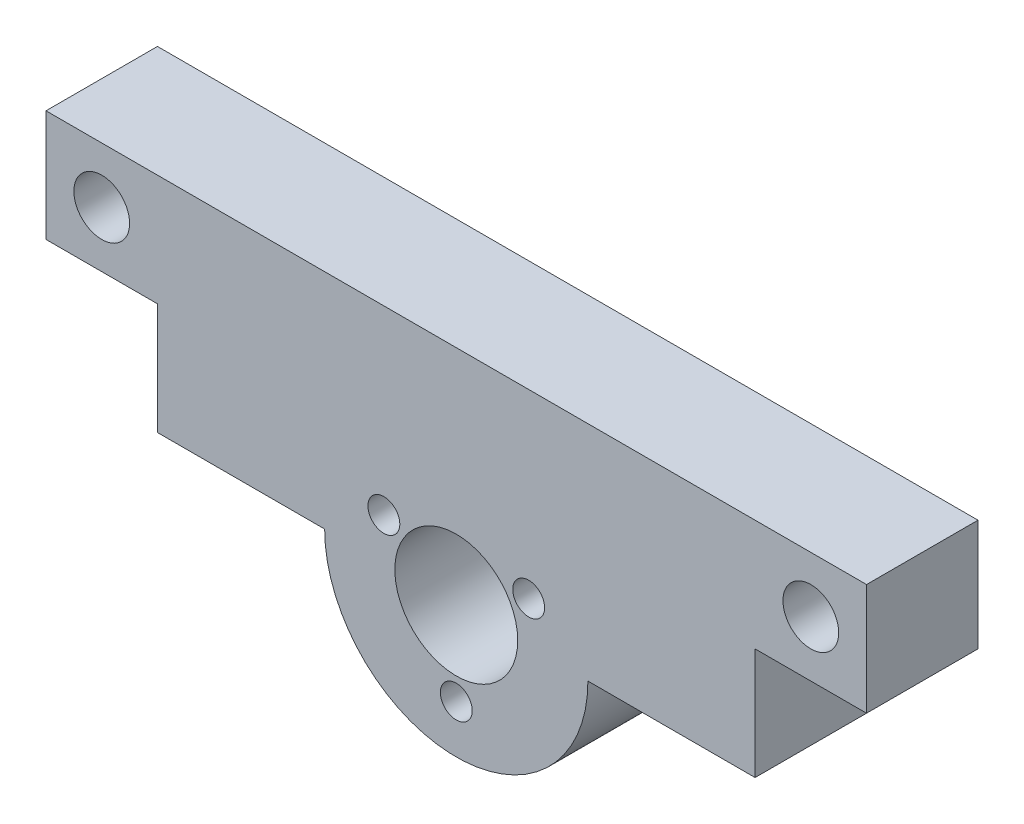
ISO-10303-21;
HEADER;
FILE_DESCRIPTION(('STEP AP214'),'2;1');
FILE_NAME('part.step','',(''),(''),'','','');
FILE_SCHEMA(('AUTOMOTIVE_DESIGN { 1 0 10303 214 1 1 1 1 }'));
ENDSEC;
DATA;
#1=APPLICATION_CONTEXT('core data for automotive mechanical design processes');
#2=APPLICATION_PROTOCOL_DEFINITION('international standard','automotive_design',2000,#1);
#3=PRODUCT_CONTEXT('',#1,'mechanical');
#4=PRODUCT('Part','Part','',(#3));
#5=PRODUCT_RELATED_PRODUCT_CATEGORY('part','',(#4));
#6=PRODUCT_DEFINITION_FORMATION('','',#4);
#7=PRODUCT_DEFINITION_CONTEXT('part definition',#1,'design');
#8=PRODUCT_DEFINITION('design','',#6,#7);
#9=PRODUCT_DEFINITION_SHAPE('','',#8);
#10=(LENGTH_UNIT() NAMED_UNIT(*) SI_UNIT(.MILLI.,.METRE.));
#11=(NAMED_UNIT(*) PLANE_ANGLE_UNIT() SI_UNIT($,.RADIAN.));
#12=(NAMED_UNIT(*) SI_UNIT($,.STERADIAN.) SOLID_ANGLE_UNIT());
#13=UNCERTAINTY_MEASURE_WITH_UNIT(LENGTH_MEASURE(1.E-05),#10,'distance_accuracy_value','');
#14=(GEOMETRIC_REPRESENTATION_CONTEXT(3) GLOBAL_UNCERTAINTY_ASSIGNED_CONTEXT((#13)) GLOBAL_UNIT_ASSIGNED_CONTEXT((#10,
#11,#12)) REPRESENTATION_CONTEXT('',''));
#15=CARTESIAN_POINT('',(0.,0.,0.));
#16=DIRECTION('',(0.,0.,1.));
#17=DIRECTION('',(1.,0.,0.));
#18=AXIS2_PLACEMENT_3D('',#15,#16,#17);
#19=CARTESIAN_POINT('',(0.,9.525,12.7));
#20=DIRECTION('',(0.,-1.,0.));
#21=DIRECTION('',(0.,0.,-1.));
#22=AXIS2_PLACEMENT_3D('',#19,#20,#21);
#23=PLANE('',#22);
#24=DIRECTION('',(-1.,0.,0.));
#25=VECTOR('',#24,1.);
#26=CARTESIAN_POINT('',(0.,9.525,0.));
#27=LINE('',#26,#25);
#28=CARTESIAN_POINT('',(-15.,9.525,0.));
#29=VERTEX_POINT('',#28);
#30=CARTESIAN_POINT('',(-34.05,9.525,0.));
#31=VERTEX_POINT('',#30);
#32=EDGE_CURVE('E161',#29,#31,#27,.T.);
#33=ORIENTED_EDGE('',*,*,#32,.F.);
#34=DIRECTION('',(0.,0.,-1.));
#35=VECTOR('',#34,1.);
#36=CARTESIAN_POINT('',(-15.,9.525,12.7));
#37=LINE('',#36,#35);
#38=CARTESIAN_POINT('',(-15.,9.525,12.7));
#39=VERTEX_POINT('',#38);
#40=EDGE_CURVE('E11',#39,#29,#37,.T.);
#41=ORIENTED_EDGE('',*,*,#40,.F.);
#42=DIRECTION('',(-1.,0.,0.));
#43=VECTOR('',#42,1.);
#44=CARTESIAN_POINT('',(0.,9.525,12.7));
#45=LINE('',#44,#43);
#46=CARTESIAN_POINT('',(-34.05,9.525,12.7));
#47=VERTEX_POINT('',#46);
#48=EDGE_CURVE('E236',#39,#47,#45,.T.);
#49=ORIENTED_EDGE('',*,*,#48,.T.);
#50=DIRECTION('',(0.,0.,-1.));
#51=VECTOR('',#50,1.);
#52=CARTESIAN_POINT('',(-34.05,9.525,12.7));
#53=LINE('',#52,#51);
#54=EDGE_CURVE('E52',#47,#31,#53,.T.);
#55=ORIENTED_EDGE('',*,*,#54,.T.);
#56=EDGE_LOOP('',(#33,#41,#49,#55));
#57=FACE_BOUND('',#56,.T.);
#58=ADVANCED_FACE('F35',(#57),#23,.T.);
#59=CARTESIAN_POINT('',(0.,9.525,12.7));
#60=DIRECTION('',(0.,0.,-1.));
#61=DIRECTION('',(-1.,0.,0.));
#62=AXIS2_PLACEMENT_3D('',#59,#60,#61);
#63=CYLINDRICAL_SURFACE('',#62,15.);
#64=CARTESIAN_POINT('',(0.,9.525,0.));
#65=DIRECTION('',(0.,0.,1.));
#66=DIRECTION('',(1.,0.,0.));
#67=AXIS2_PLACEMENT_3D('',#64,#65,#66);
#68=CIRCLE('',#67,15.);
#69=CARTESIAN_POINT('',(15.,9.525,0.));
#70=VERTEX_POINT('',#69);
#71=EDGE_CURVE('E163',#29,#70,#68,.T.);
#72=ORIENTED_EDGE('',*,*,#71,.T.);
#73=DIRECTION('',(0.,0.,-1.));
#74=VECTOR('',#73,1.);
#75=CARTESIAN_POINT('',(15.,9.525,12.7));
#76=LINE('',#75,#74);
#77=CARTESIAN_POINT('',(15.,9.525,12.7));
#78=VERTEX_POINT('',#77);
#79=EDGE_CURVE('E44',#78,#70,#76,.T.);
#80=ORIENTED_EDGE('',*,*,#79,.F.);
#81=CARTESIAN_POINT('',(0.,9.525,12.7));
#82=DIRECTION('',(0.,0.,1.));
#83=DIRECTION('',(1.,0.,0.));
#84=AXIS2_PLACEMENT_3D('',#81,#82,#83);
#85=CIRCLE('',#84,15.);
#86=EDGE_CURVE('E232',#39,#78,#85,.T.);
#87=ORIENTED_EDGE('',*,*,#86,.F.);
#88=ORIENTED_EDGE('',*,*,#40,.T.);
#89=EDGE_LOOP('',(#72,#80,#87,#88));
#90=FACE_BOUND('',#89,.T.);
#91=ADVANCED_FACE('F219',(#90),#63,.T.);
#92=CARTESIAN_POINT('',(0.,9.525,12.7));
#93=DIRECTION('',(0.,-1.,0.));
#94=DIRECTION('',(0.,0.,-1.));
#95=AXIS2_PLACEMENT_3D('',#92,#93,#94);
#96=PLANE('',#95);
#97=DIRECTION('',(-1.,0.,0.));
#98=VECTOR('',#97,1.);
#99=CARTESIAN_POINT('',(0.,9.525,0.));
#100=LINE('',#99,#98);
#101=CARTESIAN_POINT('',(34.05,9.525,0.));
#102=VERTEX_POINT('',#101);
#103=EDGE_CURVE('E166',#102,#70,#100,.T.);
#104=ORIENTED_EDGE('',*,*,#103,.F.);
#105=DIRECTION('',(0.,0.,-1.));
#106=VECTOR('',#105,1.);
#107=CARTESIAN_POINT('',(34.05,9.525,12.7));
#108=LINE('',#107,#106);
#109=CARTESIAN_POINT('',(34.05,9.525,12.7));
#110=VERTEX_POINT('',#109);
#111=EDGE_CURVE('E209',#110,#102,#108,.T.);
#112=ORIENTED_EDGE('',*,*,#111,.F.);
#113=DIRECTION('',(-1.,0.,0.));
#114=VECTOR('',#113,1.);
#115=CARTESIAN_POINT('',(0.,9.525,12.7));
#116=LINE('',#115,#114);
#117=EDGE_CURVE('E216',#110,#78,#116,.T.);
#118=ORIENTED_EDGE('',*,*,#117,.T.);
#119=ORIENTED_EDGE('',*,*,#79,.T.);
#120=EDGE_LOOP('',(#104,#112,#118,#119));
#121=FACE_BOUND('',#120,.T.);
#122=ADVANCED_FACE('F214',(#121),#96,.T.);
#123=CARTESIAN_POINT('',(34.05,0.,12.7));
#124=DIRECTION('',(1.,0.,0.));
#125=DIRECTION('',(0.,1.,0.));
#126=AXIS2_PLACEMENT_3D('',#123,#124,#125);
#127=PLANE('',#126);
#128=DIRECTION('',(0.,-1.,0.));
#129=VECTOR('',#128,1.);
#130=CARTESIAN_POINT('',(34.05,0.,0.));
#131=LINE('',#130,#129);
#132=CARTESIAN_POINT('',(34.05,22.225,0.));
#133=VERTEX_POINT('',#132);
#134=EDGE_CURVE('E169',#133,#102,#131,.T.);
#135=ORIENTED_EDGE('',*,*,#134,.F.);
#136=DIRECTION('',(0.,0.,-1.));
#137=VECTOR('',#136,1.);
#138=CARTESIAN_POINT('',(34.05,22.225,12.7));
#139=LINE('',#138,#137);
#140=CARTESIAN_POINT('',(34.05,22.225,12.7));
#141=VERTEX_POINT('',#140);
#142=EDGE_CURVE('E207',#141,#133,#139,.T.);
#143=ORIENTED_EDGE('',*,*,#142,.F.);
#144=DIRECTION('',(0.,-1.,0.));
#145=VECTOR('',#144,1.);
#146=CARTESIAN_POINT('',(34.05,0.,12.7));
#147=LINE('',#146,#145);
#148=EDGE_CURVE('E229',#141,#110,#147,.T.);
#149=ORIENTED_EDGE('',*,*,#148,.T.);
#150=ORIENTED_EDGE('',*,*,#111,.T.);
#151=EDGE_LOOP('',(#135,#143,#149,#150));
#152=FACE_BOUND('',#151,.T.);
#153=ADVANCED_FACE('F226',(#152),#127,.T.);
#154=CARTESIAN_POINT('',(0.,22.225,12.7));
#155=DIRECTION('',(0.,-1.,0.));
#156=DIRECTION('',(0.,0.,-1.));
#157=AXIS2_PLACEMENT_3D('',#154,#155,#156);
#158=PLANE('',#157);
#159=DIRECTION('',(-1.,0.,0.));
#160=VECTOR('',#159,1.);
#161=CARTESIAN_POINT('',(0.,22.225,0.));
#162=LINE('',#161,#160);
#163=CARTESIAN_POINT('',(46.75,22.225,0.));
#164=VERTEX_POINT('',#163);
#165=EDGE_CURVE('E172',#164,#133,#162,.T.);
#166=ORIENTED_EDGE('',*,*,#165,.F.);
#167=DIRECTION('',(0.,0.,-1.));
#168=VECTOR('',#167,1.);
#169=CARTESIAN_POINT('',(46.75,22.225,12.7));
#170=LINE('',#169,#168);
#171=CARTESIAN_POINT('',(46.75,22.225,12.7));
#172=VERTEX_POINT('',#171);
#173=EDGE_CURVE('E205',#172,#164,#170,.T.);
#174=ORIENTED_EDGE('',*,*,#173,.F.);
#175=DIRECTION('',(-1.,0.,0.));
#176=VECTOR('',#175,1.);
#177=CARTESIAN_POINT('',(0.,22.225,12.7));
#178=LINE('',#177,#176);
#179=EDGE_CURVE('E234',#172,#141,#178,.T.);
#180=ORIENTED_EDGE('',*,*,#179,.T.);
#181=ORIENTED_EDGE('',*,*,#142,.T.);
#182=EDGE_LOOP('',(#166,#174,#180,#181));
#183=FACE_BOUND('',#182,.T.);
#184=ADVANCED_FACE('F272',(#183),#158,.T.);
#185=CARTESIAN_POINT('',(46.75,0.,12.7));
#186=DIRECTION('',(1.,0.,0.));
#187=DIRECTION('',(0.,0.,-1.));
#188=AXIS2_PLACEMENT_3D('',#185,#186,#187);
#189=PLANE('',#188);
#190=DIRECTION('',(0.,-1.,0.));
#191=VECTOR('',#190,1.);
#192=CARTESIAN_POINT('',(46.75,0.,0.));
#193=LINE('',#192,#191);
#194=CARTESIAN_POINT('',(46.75,34.925,0.));
#195=VERTEX_POINT('',#194);
#196=EDGE_CURVE('E175',#195,#164,#193,.T.);
#197=ORIENTED_EDGE('',*,*,#196,.F.);
#198=DIRECTION('',(0.,0.,-1.));
#199=VECTOR('',#198,1.);
#200=CARTESIAN_POINT('',(46.75,34.925,12.7));
#201=LINE('',#200,#199);
#202=CARTESIAN_POINT('',(46.75,34.925,12.7));
#203=VERTEX_POINT('',#202);
#204=EDGE_CURVE('E203',#203,#195,#201,.T.);
#205=ORIENTED_EDGE('',*,*,#204,.F.);
#206=DIRECTION('',(0.,-1.,0.));
#207=VECTOR('',#206,1.);
#208=CARTESIAN_POINT('',(46.75,0.,12.7));
#209=LINE('',#208,#207);
#210=EDGE_CURVE('E241',#203,#172,#209,.T.);
#211=ORIENTED_EDGE('',*,*,#210,.T.);
#212=ORIENTED_EDGE('',*,*,#173,.T.);
#213=EDGE_LOOP('',(#197,#205,#211,#212));
#214=FACE_BOUND('',#213,.T.);
#215=ADVANCED_FACE('F275',(#214),#189,.T.);
#216=CARTESIAN_POINT('',(0.,34.925,12.7));
#217=DIRECTION('',(0.,1.,0.));
#218=DIRECTION('',(0.,0.,1.));
#219=AXIS2_PLACEMENT_3D('',#216,#217,#218);
#220=PLANE('',#219);
#221=DIRECTION('',(1.,0.,0.));
#222=VECTOR('',#221,1.);
#223=CARTESIAN_POINT('',(0.,34.925,0.));
#224=LINE('',#223,#222);
#225=CARTESIAN_POINT('',(-46.75,34.925,0.));
#226=VERTEX_POINT('',#225);
#227=EDGE_CURVE('E178',#226,#195,#224,.T.);
#228=ORIENTED_EDGE('',*,*,#227,.F.);
#229=DIRECTION('',(0.,0.,-1.));
#230=VECTOR('',#229,1.);
#231=CARTESIAN_POINT('',(-46.75,34.925,12.7));
#232=LINE('',#231,#230);
#233=CARTESIAN_POINT('',(-46.75,34.925,12.7));
#234=VERTEX_POINT('',#233);
#235=EDGE_CURVE('E123',#234,#226,#232,.T.);
#236=ORIENTED_EDGE('',*,*,#235,.F.);
#237=DIRECTION('',(1.,0.,0.));
#238=VECTOR('',#237,1.);
#239=CARTESIAN_POINT('',(0.,34.925,12.7));
#240=LINE('',#239,#238);
#241=EDGE_CURVE('E135',#234,#203,#240,.T.);
#242=ORIENTED_EDGE('',*,*,#241,.T.);
#243=ORIENTED_EDGE('',*,*,#204,.T.);
#244=EDGE_LOOP('',(#228,#236,#242,#243));
#245=FACE_BOUND('',#244,.T.);
#246=ADVANCED_FACE('F245',(#245),#220,.T.);
#247=CARTESIAN_POINT('',(-46.75,0.,12.7));
#248=DIRECTION('',(-1.,0.,0.));
#249=DIRECTION('',(0.,0.,1.));
#250=AXIS2_PLACEMENT_3D('',#247,#248,#249);
#251=PLANE('',#250);
#252=DIRECTION('',(0.,1.,0.));
#253=VECTOR('',#252,1.);
#254=CARTESIAN_POINT('',(-46.75,0.,0.));
#255=LINE('',#254,#253);
#256=CARTESIAN_POINT('',(-46.75,22.225,0.));
#257=VERTEX_POINT('',#256);
#258=EDGE_CURVE('E119',#257,#226,#255,.T.);
#259=ORIENTED_EDGE('',*,*,#258,.F.);
#260=DIRECTION('',(0.,0.,-1.));
#261=VECTOR('',#260,1.);
#262=CARTESIAN_POINT('',(-46.75,22.225,12.7));
#263=LINE('',#262,#261);
#264=CARTESIAN_POINT('',(-46.75,22.225,12.7));
#265=VERTEX_POINT('',#264);
#266=EDGE_CURVE('E114',#265,#257,#263,.T.);
#267=ORIENTED_EDGE('',*,*,#266,.F.);
#268=DIRECTION('',(0.,1.,0.));
#269=VECTOR('',#268,1.);
#270=CARTESIAN_POINT('',(-46.75,0.,12.7));
#271=LINE('',#270,#269);
#272=EDGE_CURVE('E117',#265,#234,#271,.T.);
#273=ORIENTED_EDGE('',*,*,#272,.T.);
#274=ORIENTED_EDGE('',*,*,#235,.T.);
#275=EDGE_LOOP('',(#259,#267,#273,#274));
#276=FACE_BOUND('',#275,.T.);
#277=ADVANCED_FACE('F116',(#276),#251,.T.);
#278=CARTESIAN_POINT('',(0.,22.225,12.7));
#279=DIRECTION('',(0.,-1.,0.));
#280=DIRECTION('',(0.,0.,-1.));
#281=AXIS2_PLACEMENT_3D('',#278,#279,#280);
#282=PLANE('',#281);
#283=DIRECTION('',(-1.,0.,0.));
#284=VECTOR('',#283,1.);
#285=CARTESIAN_POINT('',(0.,22.225,0.));
#286=LINE('',#285,#284);
#287=CARTESIAN_POINT('',(-34.05,22.225,0.));
#288=VERTEX_POINT('',#287);
#289=EDGE_CURVE('E182',#288,#257,#286,.T.);
#290=ORIENTED_EDGE('',*,*,#289,.F.);
#291=DIRECTION('',(0.,0.,-1.));
#292=VECTOR('',#291,1.);
#293=CARTESIAN_POINT('',(-34.05,22.225,12.7));
#294=LINE('',#293,#292);
#295=CARTESIAN_POINT('',(-34.05,22.225,12.7));
#296=VERTEX_POINT('',#295);
#297=EDGE_CURVE('E83',#296,#288,#294,.T.);
#298=ORIENTED_EDGE('',*,*,#297,.F.);
#299=DIRECTION('',(-1.,0.,0.));
#300=VECTOR('',#299,1.);
#301=CARTESIAN_POINT('',(0.,22.225,12.7));
#302=LINE('',#301,#300);
#303=EDGE_CURVE('E132',#296,#265,#302,.T.);
#304=ORIENTED_EDGE('',*,*,#303,.T.);
#305=ORIENTED_EDGE('',*,*,#266,.T.);
#306=EDGE_LOOP('',(#290,#298,#304,#305));
#307=FACE_BOUND('',#306,.T.);
#308=ADVANCED_FACE('F137',(#307),#282,.T.);
#309=CARTESIAN_POINT('',(0.,0.,12.7));
#310=DIRECTION('',(0.,0.,-1.));
#311=DIRECTION('',(-1.,0.,0.));
#312=AXIS2_PLACEMENT_3D('',#309,#310,#311);
#313=CYLINDRICAL_SURFACE('',#312,1.8161);
#314=CARTESIAN_POINT('',(0.,0.,12.7));
#315=DIRECTION('',(0.,0.,1.));
#316=DIRECTION('',(1.,0.,0.));
#317=AXIS2_PLACEMENT_3D('',#314,#315,#316);
#318=CIRCLE('',#317,1.8161);
#319=CARTESIAN_POINT('',(1.8161,0.,12.7));
#320=VERTEX_POINT('',#319);
#321=EDGE_CURVE('E149',#320,#320,#318,.T.);
#322=ORIENTED_EDGE('',*,*,#321,.T.);
#323=EDGE_LOOP('',(#322));
#324=FACE_BOUND('',#323,.T.);
#325=CARTESIAN_POINT('',(0.,0.,0.));
#326=DIRECTION('',(0.,0.,1.));
#327=DIRECTION('',(1.,0.,0.));
#328=AXIS2_PLACEMENT_3D('',#325,#326,#327);
#329=CIRCLE('',#328,1.8161);
#330=CARTESIAN_POINT('',(1.8161,0.,0.));
#331=VERTEX_POINT('',#330);
#332=EDGE_CURVE('E193',#331,#331,#329,.T.);
#333=ORIENTED_EDGE('',*,*,#332,.F.);
#334=EDGE_LOOP('',(#333));
#335=FACE_BOUND('',#334,.T.);
#336=ADVANCED_FACE('F284',(#324,#335),#313,.F.);
#337=CARTESIAN_POINT('',(8.24889197104678,14.2875,12.7));
#338=DIRECTION('',(0.,0.,-1.));
#339=DIRECTION('',(-1.,0.,0.));
#340=AXIS2_PLACEMENT_3D('',#337,#338,#339);
#341=CYLINDRICAL_SURFACE('',#340,1.8161);
#342=CARTESIAN_POINT('',(8.24889197104678,14.2875,12.7));
#343=DIRECTION('',(0.,0.,1.));
#344=DIRECTION('',(1.,0.,0.));
#345=AXIS2_PLACEMENT_3D('',#342,#343,#344);
#346=CIRCLE('',#345,1.8161);
#347=CARTESIAN_POINT('',(10.0649919710468,14.2875,12.7));
#348=VERTEX_POINT('',#347);
#349=EDGE_CURVE('E146',#348,#348,#346,.T.);
#350=ORIENTED_EDGE('',*,*,#349,.T.);
#351=EDGE_LOOP('',(#350));
#352=FACE_BOUND('',#351,.T.);
#353=CARTESIAN_POINT('',(8.24889197104678,14.2875,0.));
#354=DIRECTION('',(0.,0.,1.));
#355=DIRECTION('',(1.,0.,0.));
#356=AXIS2_PLACEMENT_3D('',#353,#354,#355);
#357=CIRCLE('',#356,1.8161);
#358=CARTESIAN_POINT('',(10.0649919710468,14.2875,0.));
#359=VERTEX_POINT('',#358);
#360=EDGE_CURVE('E190',#359,#359,#357,.T.);
#361=ORIENTED_EDGE('',*,*,#360,.F.);
#362=EDGE_LOOP('',(#361));
#363=FACE_BOUND('',#362,.T.);
#364=ADVANCED_FACE('F257',(#352,#363),#341,.F.);
#365=CARTESIAN_POINT('',(0.,9.525,12.7));
#366=DIRECTION('',(0.,0.,-1.));
#367=DIRECTION('',(-1.,0.,0.));
#368=AXIS2_PLACEMENT_3D('',#365,#366,#367);
#369=CYLINDRICAL_SURFACE('',#368,7.);
#370=CARTESIAN_POINT('',(0.,9.525,12.7));
#371=DIRECTION('',(0.,0.,1.));
#372=DIRECTION('',(1.,0.,0.));
#373=AXIS2_PLACEMENT_3D('',#370,#371,#372);
#374=CIRCLE('',#373,7.);
#375=CARTESIAN_POINT('',(7.,9.525,12.7));
#376=VERTEX_POINT('',#375);
#377=EDGE_CURVE('E140',#376,#376,#374,.T.);
#378=ORIENTED_EDGE('',*,*,#377,.T.);
#379=EDGE_LOOP('',(#378));
#380=FACE_BOUND('',#379,.T.);
#381=CARTESIAN_POINT('',(0.,9.525,0.));
#382=DIRECTION('',(0.,0.,1.));
#383=DIRECTION('',(1.,0.,0.));
#384=AXIS2_PLACEMENT_3D('',#381,#382,#383);
#385=CIRCLE('',#384,7.);
#386=CARTESIAN_POINT('',(7.,9.525,0.));
#387=VERTEX_POINT('',#386);
#388=EDGE_CURVE('E187',#387,#387,#385,.T.);
#389=ORIENTED_EDGE('',*,*,#388,.F.);
#390=EDGE_LOOP('',(#389));
#391=FACE_BOUND('',#390,.T.);
#392=ADVANCED_FACE('F250',(#380,#391),#369,.F.);
#393=CARTESIAN_POINT('',(-34.05,0.,12.7));
#394=DIRECTION('',(-1.,0.,0.));
#395=DIRECTION('',(0.,-1.,0.));
#396=AXIS2_PLACEMENT_3D('',#393,#394,#395);
#397=PLANE('',#396);
#398=DIRECTION('',(0.,1.,0.));
#399=VECTOR('',#398,1.);
#400=CARTESIAN_POINT('',(-34.05,0.,0.));
#401=LINE('',#400,#399);
#402=EDGE_CURVE('E184',#31,#288,#401,.T.);
#403=ORIENTED_EDGE('',*,*,#402,.F.);
#404=ORIENTED_EDGE('',*,*,#54,.F.);
#405=DIRECTION('',(0.,1.,0.));
#406=VECTOR('',#405,1.);
#407=CARTESIAN_POINT('',(-34.05,0.,12.7));
#408=LINE('',#407,#406);
#409=EDGE_CURVE('E138',#47,#296,#408,.T.);
#410=ORIENTED_EDGE('',*,*,#409,.T.);
#411=ORIENTED_EDGE('',*,*,#297,.T.);
#412=EDGE_LOOP('',(#403,#404,#410,#411));
#413=FACE_BOUND('',#412,.T.);
#414=ADVANCED_FACE('F247',(#413),#397,.T.);
#415=CARTESIAN_POINT('',(-40.4,28.575,12.7));
#416=DIRECTION('',(0.,0.,-1.));
#417=DIRECTION('',(-1.,0.,0.));
#418=AXIS2_PLACEMENT_3D('',#415,#416,#417);
#419=CYLINDRICAL_SURFACE('',#418,3.175);
#420=CARTESIAN_POINT('',(-40.4,28.575,12.7));
#421=DIRECTION('',(0.,0.,1.));
#422=DIRECTION('',(1.,0.,0.));
#423=AXIS2_PLACEMENT_3D('',#420,#421,#422);
#424=CIRCLE('',#423,3.175);
#425=CARTESIAN_POINT('',(-37.225,28.575,12.7));
#426=VERTEX_POINT('',#425);
#427=EDGE_CURVE('E313',#426,#426,#424,.T.);
#428=ORIENTED_EDGE('',*,*,#427,.T.);
#429=EDGE_LOOP('',(#428));
#430=FACE_BOUND('',#429,.T.);
#431=CARTESIAN_POINT('',(-40.4,28.575,0.));
#432=DIRECTION('',(0.,0.,1.));
#433=DIRECTION('',(1.,0.,0.));
#434=AXIS2_PLACEMENT_3D('',#431,#432,#433);
#435=CIRCLE('',#434,3.175);
#436=CARTESIAN_POINT('',(-37.225,28.575,0.));
#437=VERTEX_POINT('',#436);
#438=EDGE_CURVE('E158',#437,#437,#435,.T.);
#439=ORIENTED_EDGE('',*,*,#438,.F.);
#440=EDGE_LOOP('',(#439));
#441=FACE_BOUND('',#440,.T.);
#442=ADVANCED_FACE('F249',(#430,#441),#419,.F.);
#443=CARTESIAN_POINT('',(40.4,28.575,12.7));
#444=DIRECTION('',(0.,0.,-1.));
#445=DIRECTION('',(-1.,0.,0.));
#446=AXIS2_PLACEMENT_3D('',#443,#444,#445);
#447=CYLINDRICAL_SURFACE('',#446,3.175);
#448=CARTESIAN_POINT('',(40.4,28.575,12.7));
#449=DIRECTION('',(0.,0.,1.));
#450=DIRECTION('',(1.,0.,0.));
#451=AXIS2_PLACEMENT_3D('',#448,#449,#450);
#452=CIRCLE('',#451,3.175);
#453=CARTESIAN_POINT('',(43.575,28.575,12.7));
#454=VERTEX_POINT('',#453);
#455=EDGE_CURVE('E199',#454,#454,#452,.T.);
#456=ORIENTED_EDGE('',*,*,#455,.T.);
#457=EDGE_LOOP('',(#456));
#458=FACE_BOUND('',#457,.T.);
#459=CARTESIAN_POINT('',(40.4,28.575,0.));
#460=DIRECTION('',(0.,0.,1.));
#461=DIRECTION('',(1.,0.,0.));
#462=AXIS2_PLACEMENT_3D('',#459,#460,#461);
#463=CIRCLE('',#462,3.175);
#464=CARTESIAN_POINT('',(43.575,28.575,0.));
#465=VERTEX_POINT('',#464);
#466=EDGE_CURVE('E155',#465,#465,#463,.T.);
#467=ORIENTED_EDGE('',*,*,#466,.F.);
#468=EDGE_LOOP('',(#467));
#469=FACE_BOUND('',#468,.T.);
#470=ADVANCED_FACE('F37',(#458,#469),#447,.F.);
#471=CARTESIAN_POINT('',(-8.24889197104678,14.2875,12.7));
#472=DIRECTION('',(0.,0.,-1.));
#473=DIRECTION('',(-1.,0.,0.));
#474=AXIS2_PLACEMENT_3D('',#471,#472,#473);
#475=CYLINDRICAL_SURFACE('',#474,1.8161);
#476=CARTESIAN_POINT('',(-8.24889197104678,14.2875,12.7));
#477=DIRECTION('',(0.,0.,1.));
#478=DIRECTION('',(1.,0.,0.));
#479=AXIS2_PLACEMENT_3D('',#476,#477,#478);
#480=CIRCLE('',#479,1.8161);
#481=CARTESIAN_POINT('',(-6.43279197104678,14.2875,12.7));
#482=VERTEX_POINT('',#481);
#483=EDGE_CURVE('E152',#482,#482,#480,.T.);
#484=ORIENTED_EDGE('',*,*,#483,.T.);
#485=EDGE_LOOP('',(#484));
#486=FACE_BOUND('',#485,.T.);
#487=CARTESIAN_POINT('',(-8.24889197104678,14.2875,0.));
#488=DIRECTION('',(0.,0.,1.));
#489=DIRECTION('',(1.,0.,0.));
#490=AXIS2_PLACEMENT_3D('',#487,#488,#489);
#491=CIRCLE('',#490,1.8161);
#492=CARTESIAN_POINT('',(-6.43279197104678,14.2875,0.));
#493=VERTEX_POINT('',#492);
#494=EDGE_CURVE('E196',#493,#493,#491,.T.);
#495=ORIENTED_EDGE('',*,*,#494,.F.);
#496=EDGE_LOOP('',(#495));
#497=FACE_BOUND('',#496,.T.);
#498=ADVANCED_FACE('F297',(#486,#497),#475,.F.);
#499=CARTESIAN_POINT('',(0.,0.,12.7));
#500=DIRECTION('',(0.,0.,1.));
#501=DIRECTION('',(1.,0.,0.));
#502=AXIS2_PLACEMENT_3D('',#499,#500,#501);
#503=PLANE('',#502);
#504=ORIENTED_EDGE('',*,*,#455,.F.);
#505=EDGE_LOOP('',(#504));
#506=FACE_BOUND('',#505,.T.);
#507=ORIENTED_EDGE('',*,*,#427,.F.);
#508=EDGE_LOOP('',(#507));
#509=FACE_BOUND('',#508,.T.);
#510=ORIENTED_EDGE('',*,*,#48,.F.);
#511=ORIENTED_EDGE('',*,*,#86,.T.);
#512=ORIENTED_EDGE('',*,*,#117,.F.);
#513=ORIENTED_EDGE('',*,*,#148,.F.);
#514=ORIENTED_EDGE('',*,*,#179,.F.);
#515=ORIENTED_EDGE('',*,*,#210,.F.);
#516=ORIENTED_EDGE('',*,*,#241,.F.);
#517=ORIENTED_EDGE('',*,*,#272,.F.);
#518=ORIENTED_EDGE('',*,*,#303,.F.);
#519=ORIENTED_EDGE('',*,*,#409,.F.);
#520=EDGE_LOOP('',(#510,#511,#512,#513,#514,#515,#516,#517,#518,#519));
#521=FACE_BOUND('',#520,.T.);
#522=ORIENTED_EDGE('',*,*,#377,.F.);
#523=EDGE_LOOP('',(#522));
#524=FACE_BOUND('',#523,.T.);
#525=ORIENTED_EDGE('',*,*,#349,.F.);
#526=EDGE_LOOP('',(#525));
#527=FACE_BOUND('',#526,.T.);
#528=ORIENTED_EDGE('',*,*,#321,.F.);
#529=EDGE_LOOP('',(#528));
#530=FACE_BOUND('',#529,.T.);
#531=ORIENTED_EDGE('',*,*,#483,.F.);
#532=EDGE_LOOP('',(#531));
#533=FACE_BOUND('',#532,.T.);
#534=ADVANCED_FACE('F129',(#506,#509,#521,#524,#527,#530,#533),#503,.T.);
#535=CARTESIAN_POINT('',(0.,0.,0.));
#536=DIRECTION('',(0.,0.,1.));
#537=DIRECTION('',(1.,0.,0.));
#538=AXIS2_PLACEMENT_3D('',#535,#536,#537);
#539=PLANE('',#538);
#540=ORIENTED_EDGE('',*,*,#466,.T.);
#541=EDGE_LOOP('',(#540));
#542=FACE_BOUND('',#541,.T.);
#543=ORIENTED_EDGE('',*,*,#438,.T.);
#544=EDGE_LOOP('',(#543));
#545=FACE_BOUND('',#544,.T.);
#546=ORIENTED_EDGE('',*,*,#32,.T.);
#547=ORIENTED_EDGE('',*,*,#402,.T.);
#548=ORIENTED_EDGE('',*,*,#289,.T.);
#549=ORIENTED_EDGE('',*,*,#258,.T.);
#550=ORIENTED_EDGE('',*,*,#227,.T.);
#551=ORIENTED_EDGE('',*,*,#196,.T.);
#552=ORIENTED_EDGE('',*,*,#165,.T.);
#553=ORIENTED_EDGE('',*,*,#134,.T.);
#554=ORIENTED_EDGE('',*,*,#103,.T.);
#555=ORIENTED_EDGE('',*,*,#71,.F.);
#556=EDGE_LOOP('',(#546,#547,#548,#549,#550,#551,#552,#553,#554,#555));
#557=FACE_BOUND('',#556,.T.);
#558=ORIENTED_EDGE('',*,*,#388,.T.);
#559=EDGE_LOOP('',(#558));
#560=FACE_BOUND('',#559,.T.);
#561=ORIENTED_EDGE('',*,*,#360,.T.);
#562=EDGE_LOOP('',(#561));
#563=FACE_BOUND('',#562,.T.);
#564=ORIENTED_EDGE('',*,*,#332,.T.);
#565=EDGE_LOOP('',(#564));
#566=FACE_BOUND('',#565,.T.);
#567=ORIENTED_EDGE('',*,*,#494,.T.);
#568=EDGE_LOOP('',(#567));
#569=FACE_BOUND('',#568,.T.);
#570=ADVANCED_FACE('F221',(#542,#545,#557,#560,#563,#566,#569),#539,.F.);
#571=CLOSED_SHELL('',(#58,#91,#122,#153,#184,#215,#246,#277,#308,#336,#364,#392,#414,#442,#470,
#498,#534,#570));
#572=MANIFOLD_SOLID_BREP('B2',#571);
#573=ADVANCED_BREP_SHAPE_REPRESENTATION('',(#18,#572),#14);
#574=SHAPE_DEFINITION_REPRESENTATION(#9,#573);
ENDSEC;
END-ISO-10303-21;
